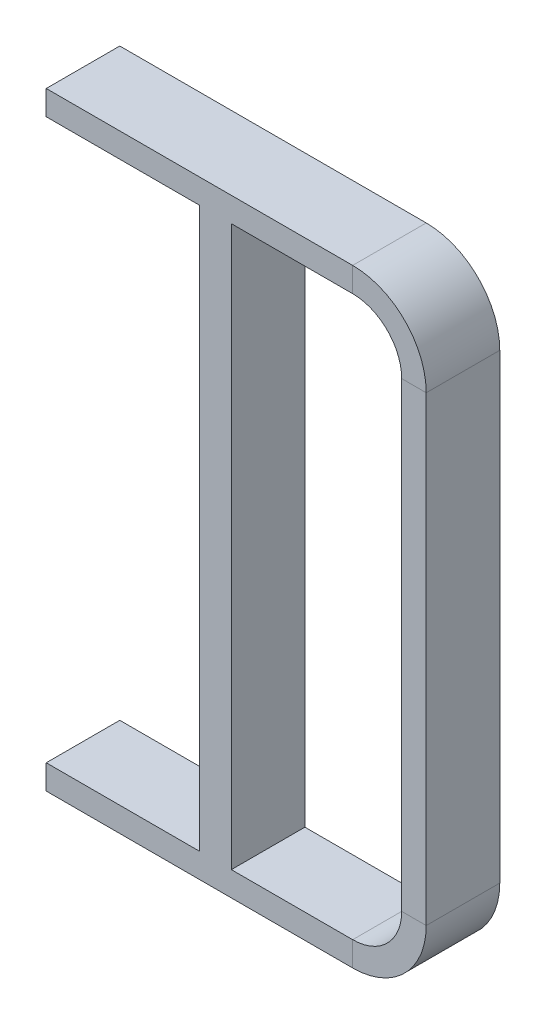
ISO-10303-21;
HEADER;
FILE_DESCRIPTION(('STEP AP214'),'2;1');
FILE_NAME('part.step','',(''),(''),'','','');
FILE_SCHEMA(('AUTOMOTIVE_DESIGN { 1 0 10303 214 1 1 1 1 }'));
ENDSEC;
DATA;
#1=APPLICATION_CONTEXT('core data for automotive mechanical design processes');
#2=APPLICATION_PROTOCOL_DEFINITION('international standard','automotive_design',2000,#1);
#3=PRODUCT_CONTEXT('',#1,'mechanical');
#4=PRODUCT('Part','Part','',(#3));
#5=PRODUCT_RELATED_PRODUCT_CATEGORY('part','',(#4));
#6=PRODUCT_DEFINITION_FORMATION('','',#4);
#7=PRODUCT_DEFINITION_CONTEXT('part definition',#1,'design');
#8=PRODUCT_DEFINITION('design','',#6,#7);
#9=PRODUCT_DEFINITION_SHAPE('','',#8);
#10=(LENGTH_UNIT() NAMED_UNIT(*) SI_UNIT(.MILLI.,.METRE.));
#11=(NAMED_UNIT(*) PLANE_ANGLE_UNIT() SI_UNIT($,.RADIAN.));
#12=(NAMED_UNIT(*) SI_UNIT($,.STERADIAN.) SOLID_ANGLE_UNIT());
#13=UNCERTAINTY_MEASURE_WITH_UNIT(LENGTH_MEASURE(1.E-05),#10,'distance_accuracy_value','');
#14=(GEOMETRIC_REPRESENTATION_CONTEXT(3) GLOBAL_UNCERTAINTY_ASSIGNED_CONTEXT((#13)) GLOBAL_UNIT_ASSIGNED_CONTEXT((#10,
#11,#12)) REPRESENTATION_CONTEXT('',''));
#15=CARTESIAN_POINT('',(0.,0.,0.));
#16=DIRECTION('',(0.,0.,1.));
#17=DIRECTION('',(1.,0.,0.));
#18=AXIS2_PLACEMENT_3D('',#15,#16,#17);
#19=CARTESIAN_POINT('',(0.,-25.4,76.2));
#20=DIRECTION('',(0.,-1.,0.));
#21=DIRECTION('',(0.,0.,-1.));
#22=AXIS2_PLACEMENT_3D('',#19,#20,#21);
#23=PLANE('',#22);
#24=DIRECTION('',(0.,0.,1.));
#25=VECTOR('',#24,1.);
#26=CARTESIAN_POINT('',(383.598972621392,-25.4,76.2000000000001));
#27=LINE('',#26,#25);
#28=CARTESIAN_POINT('',(383.598972621392,-25.4,-76.2));
#29=VERTEX_POINT('',#28);
#30=CARTESIAN_POINT('',(383.598972621392,-25.4,76.2));
#31=VERTEX_POINT('',#30);
#32=EDGE_CURVE('E183',#29,#31,#27,.T.);
#33=ORIENTED_EDGE('',*,*,#32,.F.);
#34=DIRECTION('',(1.,0.,0.));
#35=VECTOR('',#34,1.);
#36=CARTESIAN_POINT('',(0.,-25.4,-76.2));
#37=LINE('',#36,#35);
#38=CARTESIAN_POINT('',(635.,-25.4,-76.2));
#39=VERTEX_POINT('',#38);
#40=EDGE_CURVE('E157',#29,#39,#37,.T.);
#41=ORIENTED_EDGE('',*,*,#40,.T.);
#42=DIRECTION('',(0.,0.,-1.));
#43=VECTOR('',#42,1.);
#44=CARTESIAN_POINT('',(635.,-25.4,76.2));
#45=LINE('',#44,#43);
#46=CARTESIAN_POINT('',(635.,-25.4,76.2));
#47=VERTEX_POINT('',#46);
#48=EDGE_CURVE('E194',#47,#39,#45,.T.);
#49=ORIENTED_EDGE('',*,*,#48,.F.);
#50=DIRECTION('',(1.,0.,0.));
#51=VECTOR('',#50,1.);
#52=CARTESIAN_POINT('',(0.,-25.4,76.2));
#53=LINE('',#52,#51);
#54=EDGE_CURVE('E53',#31,#47,#53,.T.);
#55=ORIENTED_EDGE('',*,*,#54,.F.);
#56=EDGE_LOOP('',(#33,#41,#49,#55));
#57=FACE_BOUND('',#56,.T.);
#58=ADVANCED_FACE('F38',(#57),#23,.T.);
#59=CARTESIAN_POINT('',(635.,-1184.656,76.2));
#60=DIRECTION('',(0.,1.,0.));
#61=DIRECTION('',(-1.,0.,0.));
#62=AXIS2_PLACEMENT_3D('',#59,#60,#61);
#63=PLANE('',#62);
#64=DIRECTION('',(0.,0.,-1.));
#65=VECTOR('',#64,1.);
#66=CARTESIAN_POINT('',(383.598972621392,-1184.656,76.1999999999999));
#67=LINE('',#66,#65);
#68=CARTESIAN_POINT('',(383.598972621392,-1184.656,76.2));
#69=VERTEX_POINT('',#68);
#70=CARTESIAN_POINT('',(383.598972621392,-1184.656,-76.2));
#71=VERTEX_POINT('',#70);
#72=EDGE_CURVE('E167',#69,#71,#67,.T.);
#73=ORIENTED_EDGE('',*,*,#72,.F.);
#74=DIRECTION('',(-1.,0.,0.));
#75=VECTOR('',#74,1.);
#76=CARTESIAN_POINT('',(635.,-1184.656,76.2));
#77=LINE('',#76,#75);
#78=CARTESIAN_POINT('',(635.,-1184.656,76.2));
#79=VERTEX_POINT('',#78);
#80=EDGE_CURVE('E235',#79,#69,#77,.T.);
#81=ORIENTED_EDGE('',*,*,#80,.F.);
#82=DIRECTION('',(0.,0.,-1.));
#83=VECTOR('',#82,1.);
#84=CARTESIAN_POINT('',(635.,-1184.656,76.2));
#85=LINE('',#84,#83);
#86=CARTESIAN_POINT('',(635.,-1184.656,-76.2));
#87=VERTEX_POINT('',#86);
#88=EDGE_CURVE('E226',#79,#87,#85,.T.);
#89=ORIENTED_EDGE('',*,*,#88,.T.);
#90=DIRECTION('',(-1.,0.,0.));
#91=VECTOR('',#90,1.);
#92=CARTESIAN_POINT('',(635.,-1184.656,-76.2));
#93=LINE('',#92,#91);
#94=EDGE_CURVE('E266',#87,#71,#93,.T.);
#95=ORIENTED_EDGE('',*,*,#94,.T.);
#96=EDGE_LOOP('',(#73,#81,#89,#95));
#97=FACE_BOUND('',#96,.T.);
#98=ADVANCED_FACE('F354',(#97),#63,.T.);
#99=CARTESIAN_POINT('',(0.,0.,0.));
#100=DIRECTION('',(1.,0.,0.));
#101=DIRECTION('',(0.,0.,-1.));
#102=AXIS2_PLACEMENT_3D('',#99,#100,#101);
#103=PLANE('',#102);
#104=DIRECTION('',(0.,1.,0.));
#105=VECTOR('',#104,1.);
#106=CARTESIAN_POINT('',(0.,25.4,-76.2));
#107=LINE('',#106,#105);
#108=CARTESIAN_POINT('',(0.,-25.4,-76.2));
#109=VERTEX_POINT('',#108);
#110=CARTESIAN_POINT('',(0.,25.4,-76.2));
#111=VERTEX_POINT('',#110);
#112=EDGE_CURVE('E243',#109,#111,#107,.T.);
#113=ORIENTED_EDGE('',*,*,#112,.F.);
#114=DIRECTION('',(0.,0.,-1.));
#115=VECTOR('',#114,1.);
#116=CARTESIAN_POINT('',(0.,-25.4,76.2));
#117=LINE('',#116,#115);
#118=CARTESIAN_POINT('',(0.,-25.4,76.2));
#119=VERTEX_POINT('',#118);
#120=EDGE_CURVE('E152',#119,#109,#117,.T.);
#121=ORIENTED_EDGE('',*,*,#120,.F.);
#122=DIRECTION('',(0.,-1.,0.));
#123=VECTOR('',#122,1.);
#124=CARTESIAN_POINT('',(0.,25.4,76.2));
#125=LINE('',#124,#123);
#126=CARTESIAN_POINT('',(0.,25.4,76.2));
#127=VERTEX_POINT('',#126);
#128=EDGE_CURVE('E185',#127,#119,#125,.T.);
#129=ORIENTED_EDGE('',*,*,#128,.F.);
#130=DIRECTION('',(0.,0.,1.));
#131=VECTOR('',#130,1.);
#132=CARTESIAN_POINT('',(0.,25.4,76.2));
#133=LINE('',#132,#131);
#134=EDGE_CURVE('E196',#111,#127,#133,.T.);
#135=ORIENTED_EDGE('',*,*,#134,.F.);
#136=EDGE_LOOP('',(#113,#121,#129,#135));
#137=FACE_BOUND('',#136,.T.);
#138=ADVANCED_FACE('F40',(#137),#103,.F.);
#139=CARTESIAN_POINT('',(3.33066907387547E-13,-1210.056,0.));
#140=DIRECTION('',(-1.,0.,0.));
#141=DIRECTION('',(0.,0.,-1.));
#142=AXIS2_PLACEMENT_3D('',#139,#140,#141);
#143=PLANE('',#142);
#144=DIRECTION('',(0.,-1.,0.));
#145=VECTOR('',#144,1.);
#146=CARTESIAN_POINT('',(3.41948691584548E-13,-1235.456,-76.2));
#147=LINE('',#146,#145);
#148=CARTESIAN_POINT('',(4.39648317751562E-13,-1184.656,-76.2));
#149=VERTEX_POINT('',#148);
#150=CARTESIAN_POINT('',(4.48530101948563E-13,-1235.456,-76.2));
#151=VERTEX_POINT('',#150);
#152=EDGE_CURVE('E268',#149,#151,#147,.T.);
#153=ORIENTED_EDGE('',*,*,#152,.T.);
#154=DIRECTION('',(0.,0.,1.));
#155=VECTOR('',#154,1.);
#156=CARTESIAN_POINT('',(3.41948691584548E-13,-1235.456,76.2));
#157=LINE('',#156,#155);
#158=CARTESIAN_POINT('',(4.48530101948563E-13,-1235.456,76.2));
#159=VERTEX_POINT('',#158);
#160=EDGE_CURVE('E11',#151,#159,#157,.T.);
#161=ORIENTED_EDGE('',*,*,#160,.T.);
#162=DIRECTION('',(0.,1.,0.));
#163=VECTOR('',#162,1.);
#164=CARTESIAN_POINT('',(3.41948691584548E-13,-1235.456,76.2));
#165=LINE('',#164,#163);
#166=CARTESIAN_POINT('',(4.39648317751562E-13,-1184.656,76.2));
#167=VERTEX_POINT('',#166);
#168=EDGE_CURVE('E230',#159,#167,#165,.T.);
#169=ORIENTED_EDGE('',*,*,#168,.T.);
#170=DIRECTION('',(0.,0.,-1.));
#171=VECTOR('',#170,1.);
#172=CARTESIAN_POINT('',(3.24185123190546E-13,-1184.656,76.2));
#173=LINE('',#172,#171);
#174=EDGE_CURVE('E238',#167,#149,#173,.T.);
#175=ORIENTED_EDGE('',*,*,#174,.T.);
#176=EDGE_LOOP('',(#153,#161,#169,#175));
#177=FACE_BOUND('',#176,.T.);
#178=ADVANCED_FACE('F350',(#177),#143,.T.);
#179=CARTESIAN_POINT('',(0.,25.4,76.2));
#180=DIRECTION('',(0.,0.,1.));
#181=DIRECTION('',(1.,0.,0.));
#182=AXIS2_PLACEMENT_3D('',#179,#180,#181);
#183=PLANE('',#182);
#184=CARTESIAN_POINT('',(317.5,-25.4,76.2));
#185=VERTEX_POINT('',#184);
#186=EDGE_CURVE('E192',#119,#185,#53,.T.);
#187=ORIENTED_EDGE('',*,*,#186,.T.);
#188=DIRECTION('',(0.,1.,0.));
#189=VECTOR('',#188,1.);
#190=CARTESIAN_POINT('',(317.5,-1203.706,76.2));
#191=LINE('',#190,#189);
#192=CARTESIAN_POINT('',(317.5,-1184.656,76.2));
#193=VERTEX_POINT('',#192);
#194=EDGE_CURVE('E166',#193,#185,#191,.T.);
#195=ORIENTED_EDGE('',*,*,#194,.F.);
#196=EDGE_CURVE('E233',#193,#167,#77,.T.);
#197=ORIENTED_EDGE('',*,*,#196,.T.);
#198=ORIENTED_EDGE('',*,*,#168,.F.);
#199=DIRECTION('',(-1.,0.,0.));
#200=VECTOR('',#199,1.);
#201=CARTESIAN_POINT('',(635.,-1235.456,76.2));
#202=LINE('',#201,#200);
#203=CARTESIAN_POINT('',(635.,-1235.456,76.2));
#204=VERTEX_POINT('',#203);
#205=EDGE_CURVE('E234',#204,#159,#202,.T.);
#206=ORIENTED_EDGE('',*,*,#205,.F.);
#207=DIRECTION('',(0.,1.,0.));
#208=VECTOR('',#207,1.);
#209=CARTESIAN_POINT('',(635.,-1235.456,76.2));
#210=LINE('',#209,#208);
#211=EDGE_CURVE('E219',#204,#79,#210,.T.);
#212=ORIENTED_EDGE('',*,*,#211,.T.);
#213=ORIENTED_EDGE('',*,*,#80,.T.);
#214=DIRECTION('',(0.,1.,0.));
#215=VECTOR('',#214,1.);
#216=CARTESIAN_POINT('',(383.598972621392,-1203.706,76.2));
#217=LINE('',#216,#215);
#218=EDGE_CURVE('E175',#69,#31,#217,.T.);
#219=ORIENTED_EDGE('',*,*,#218,.T.);
#220=ORIENTED_EDGE('',*,*,#54,.T.);
#221=DIRECTION('',(0.,-1.,0.));
#222=VECTOR('',#221,1.);
#223=CARTESIAN_POINT('',(635.,25.4,76.2));
#224=LINE('',#223,#222);
#225=CARTESIAN_POINT('',(635.,25.4,76.2));
#226=VERTEX_POINT('',#225);
#227=EDGE_CURVE('E188',#226,#47,#224,.T.);
#228=ORIENTED_EDGE('',*,*,#227,.F.);
#229=DIRECTION('',(1.,0.,0.));
#230=VECTOR('',#229,1.);
#231=CARTESIAN_POINT('',(0.,25.4,76.2));
#232=LINE('',#231,#230);
#233=EDGE_CURVE('E191',#127,#226,#232,.T.);
#234=ORIENTED_EDGE('',*,*,#233,.F.);
#235=ORIENTED_EDGE('',*,*,#128,.T.);
#236=EDGE_LOOP('',(#187,#195,#197,#198,#206,#212,#213,#219,#220,#228,#234,#235));
#237=FACE_BOUND('',#236,.T.);
#238=ADVANCED_FACE('F330',(#237),#183,.T.);
#239=DIRECTION('',(0.,0.,-1.));
#240=VECTOR('',#239,1.);
#241=CARTESIAN_POINT('',(317.5,-25.4,76.2));
#242=LINE('',#241,#240);
#243=CARTESIAN_POINT('',(317.5,-25.4000000000001,-76.2));
#244=VERTEX_POINT('',#243);
#245=EDGE_CURVE('E61',#185,#244,#242,.T.);
#246=ORIENTED_EDGE('',*,*,#245,.F.);
#247=ORIENTED_EDGE('',*,*,#186,.F.);
#248=ORIENTED_EDGE('',*,*,#120,.T.);
#249=EDGE_CURVE('E150',#109,#244,#37,.T.);
#250=ORIENTED_EDGE('',*,*,#249,.T.);
#251=EDGE_LOOP('',(#246,#247,#248,#250));
#252=FACE_BOUND('',#251,.T.);
#253=ADVANCED_FACE('F151',(#252),#23,.T.);
#254=CARTESIAN_POINT('',(0.,25.4,-76.2));
#255=DIRECTION('',(0.,0.,-1.));
#256=DIRECTION('',(-1.,0.,0.));
#257=AXIS2_PLACEMENT_3D('',#254,#255,#256);
#258=PLANE('',#257);
#259=DIRECTION('',(1.,0.,0.));
#260=VECTOR('',#259,1.);
#261=CARTESIAN_POINT('',(0.,25.4,-76.2));
#262=LINE('',#261,#260);
#263=CARTESIAN_POINT('',(635.,25.4,-76.2));
#264=VERTEX_POINT('',#263);
#265=EDGE_CURVE('E272',#111,#264,#262,.T.);
#266=ORIENTED_EDGE('',*,*,#265,.T.);
#267=DIRECTION('',(0.,1.,0.));
#268=VECTOR('',#267,1.);
#269=CARTESIAN_POINT('',(635.,25.4,-76.2));
#270=LINE('',#269,#268);
#271=EDGE_CURVE('E156',#39,#264,#270,.T.);
#272=ORIENTED_EDGE('',*,*,#271,.F.);
#273=ORIENTED_EDGE('',*,*,#40,.F.);
#274=DIRECTION('',(0.,1.,0.));
#275=VECTOR('',#274,1.);
#276=CARTESIAN_POINT('',(383.598972621392,-1203.706,-76.2));
#277=LINE('',#276,#275);
#278=EDGE_CURVE('E179',#71,#29,#277,.T.);
#279=ORIENTED_EDGE('',*,*,#278,.F.);
#280=ORIENTED_EDGE('',*,*,#94,.F.);
#281=DIRECTION('',(0.,-1.,0.));
#282=VECTOR('',#281,1.);
#283=CARTESIAN_POINT('',(635.,-1235.456,-76.2));
#284=LINE('',#283,#282);
#285=CARTESIAN_POINT('',(635.,-1235.456,-76.2));
#286=VERTEX_POINT('',#285);
#287=EDGE_CURVE('E263',#87,#286,#284,.T.);
#288=ORIENTED_EDGE('',*,*,#287,.T.);
#289=DIRECTION('',(-1.,0.,0.));
#290=VECTOR('',#289,1.);
#291=CARTESIAN_POINT('',(635.,-1235.456,-76.2));
#292=LINE('',#291,#290);
#293=EDGE_CURVE('E46',#286,#151,#292,.T.);
#294=ORIENTED_EDGE('',*,*,#293,.T.);
#295=ORIENTED_EDGE('',*,*,#152,.F.);
#296=CARTESIAN_POINT('',(317.5,-1184.656,-76.2));
#297=VERTEX_POINT('',#296);
#298=EDGE_CURVE('E173',#297,#149,#93,.T.);
#299=ORIENTED_EDGE('',*,*,#298,.F.);
#300=DIRECTION('',(0.,1.,0.));
#301=VECTOR('',#300,1.);
#302=CARTESIAN_POINT('',(317.5,-1203.706,-76.2));
#303=LINE('',#302,#301);
#304=EDGE_CURVE('E164',#297,#244,#303,.T.);
#305=ORIENTED_EDGE('',*,*,#304,.T.);
#306=ORIENTED_EDGE('',*,*,#249,.F.);
#307=ORIENTED_EDGE('',*,*,#112,.T.);
#308=EDGE_LOOP('',(#266,#272,#273,#279,#280,#288,#294,#295,#299,#305,#306,#307));
#309=FACE_BOUND('',#308,.T.);
#310=ADVANCED_FACE('F171',(#309),#258,.T.);
#311=CARTESIAN_POINT('',(0.,25.4,76.2));
#312=DIRECTION('',(0.,1.,0.));
#313=DIRECTION('',(0.,0.,1.));
#314=AXIS2_PLACEMENT_3D('',#311,#312,#313);
#315=PLANE('',#314);
#316=ORIENTED_EDGE('',*,*,#233,.T.);
#317=DIRECTION('',(0.,0.,1.));
#318=VECTOR('',#317,1.);
#319=CARTESIAN_POINT('',(635.,25.4,76.2));
#320=LINE('',#319,#318);
#321=EDGE_CURVE('E207',#264,#226,#320,.T.);
#322=ORIENTED_EDGE('',*,*,#321,.F.);
#323=ORIENTED_EDGE('',*,*,#265,.F.);
#324=ORIENTED_EDGE('',*,*,#134,.T.);
#325=EDGE_LOOP('',(#316,#322,#323,#324));
#326=FACE_BOUND('',#325,.T.);
#327=ADVANCED_FACE('F344',(#326),#315,.T.);
#328=CARTESIAN_POINT('',(635.,25.4,76.2));
#329=DIRECTION('',(0.,0.,1.));
#330=DIRECTION('',(1.,0.,0.));
#331=AXIS2_PLACEMENT_3D('',#328,#329,#330);
#332=PLANE('',#331);
#333=CARTESIAN_POINT('',(635.,-127.,76.2));
#334=DIRECTION('',(0.,0.,-1.));
#335=DIRECTION('',(0.,1.,0.));
#336=AXIS2_PLACEMENT_3D('',#333,#334,#335);
#337=CIRCLE('',#336,101.6);
#338=CARTESIAN_POINT('',(736.6,-127.,76.2));
#339=VERTEX_POINT('',#338);
#340=EDGE_CURVE('E200',#47,#339,#337,.T.);
#341=ORIENTED_EDGE('',*,*,#340,.T.);
#342=DIRECTION('',(-1.,0.,0.));
#343=VECTOR('',#342,1.);
#344=CARTESIAN_POINT('',(787.4,-127.,76.2));
#345=LINE('',#344,#343);
#346=CARTESIAN_POINT('',(787.4,-127.,76.2));
#347=VERTEX_POINT('',#346);
#348=EDGE_CURVE('E197',#347,#339,#345,.T.);
#349=ORIENTED_EDGE('',*,*,#348,.F.);
#350=CARTESIAN_POINT('',(635.,-127.,76.2));
#351=DIRECTION('',(0.,0.,-1.));
#352=DIRECTION('',(0.,1.,0.));
#353=AXIS2_PLACEMENT_3D('',#350,#351,#352);
#354=CIRCLE('',#353,152.4);
#355=EDGE_CURVE('E201',#226,#347,#354,.T.);
#356=ORIENTED_EDGE('',*,*,#355,.F.);
#357=ORIENTED_EDGE('',*,*,#227,.T.);
#358=EDGE_LOOP('',(#341,#349,#356,#357));
#359=FACE_BOUND('',#358,.T.);
#360=ADVANCED_FACE('F322',(#359),#332,.T.);
#361=CARTESIAN_POINT('',(635.,-127.,0.));
#362=DIRECTION('',(0.,0.,-1.));
#363=DIRECTION('',(-1.,0.,0.));
#364=AXIS2_PLACEMENT_3D('',#361,#362,#363);
#365=CYLINDRICAL_SURFACE('',#364,101.6);
#366=CARTESIAN_POINT('',(635.,-127.,-76.2));
#367=DIRECTION('',(0.,0.,-1.));
#368=DIRECTION('',(0.,1.,0.));
#369=AXIS2_PLACEMENT_3D('',#366,#367,#368);
#370=CIRCLE('',#369,101.6);
#371=CARTESIAN_POINT('',(736.6,-127.,-76.2));
#372=VERTEX_POINT('',#371);
#373=EDGE_CURVE('E248',#39,#372,#370,.T.);
#374=ORIENTED_EDGE('',*,*,#373,.T.);
#375=DIRECTION('',(0.,0.,-1.));
#376=VECTOR('',#375,1.);
#377=CARTESIAN_POINT('',(736.6,-127.,76.2));
#378=LINE('',#377,#376);
#379=EDGE_CURVE('E204',#339,#372,#378,.T.);
#380=ORIENTED_EDGE('',*,*,#379,.F.);
#381=ORIENTED_EDGE('',*,*,#340,.F.);
#382=ORIENTED_EDGE('',*,*,#48,.T.);
#383=EDGE_LOOP('',(#374,#380,#381,#382));
#384=FACE_BOUND('',#383,.T.);
#385=ADVANCED_FACE('F335',(#384),#365,.F.);
#386=CARTESIAN_POINT('',(635.,25.4,-76.2));
#387=DIRECTION('',(0.,0.,-1.));
#388=DIRECTION('',(-1.,0.,0.));
#389=AXIS2_PLACEMENT_3D('',#386,#387,#388);
#390=PLANE('',#389);
#391=CARTESIAN_POINT('',(635.,-127.,-76.2));
#392=DIRECTION('',(0.,0.,-1.));
#393=DIRECTION('',(0.,1.,0.));
#394=AXIS2_PLACEMENT_3D('',#391,#392,#393);
#395=CIRCLE('',#394,152.4);
#396=CARTESIAN_POINT('',(787.4,-127.,-76.2));
#397=VERTEX_POINT('',#396);
#398=EDGE_CURVE('E276',#264,#397,#395,.T.);
#399=ORIENTED_EDGE('',*,*,#398,.T.);
#400=DIRECTION('',(1.,0.,0.));
#401=VECTOR('',#400,1.);
#402=CARTESIAN_POINT('',(787.4,-127.,-76.2));
#403=LINE('',#402,#401);
#404=EDGE_CURVE('E251',#372,#397,#403,.T.);
#405=ORIENTED_EDGE('',*,*,#404,.F.);
#406=ORIENTED_EDGE('',*,*,#373,.F.);
#407=ORIENTED_EDGE('',*,*,#271,.T.);
#408=EDGE_LOOP('',(#399,#405,#406,#407));
#409=FACE_BOUND('',#408,.T.);
#410=ADVANCED_FACE('F343',(#409),#390,.T.);
#411=CARTESIAN_POINT('',(635.,-127.,0.));
#412=DIRECTION('',(0.,0.,-1.));
#413=DIRECTION('',(-1.,0.,0.));
#414=AXIS2_PLACEMENT_3D('',#411,#412,#413);
#415=CYLINDRICAL_SURFACE('',#414,152.4);
#416=DIRECTION('',(0.,0.,1.));
#417=VECTOR('',#416,1.);
#418=CARTESIAN_POINT('',(787.4,-127.,76.2));
#419=LINE('',#418,#417);
#420=EDGE_CURVE('E218',#397,#347,#419,.T.);
#421=ORIENTED_EDGE('',*,*,#420,.F.);
#422=ORIENTED_EDGE('',*,*,#398,.F.);
#423=ORIENTED_EDGE('',*,*,#321,.T.);
#424=ORIENTED_EDGE('',*,*,#355,.T.);
#425=EDGE_LOOP('',(#421,#422,#423,#424));
#426=FACE_BOUND('',#425,.T.);
#427=ADVANCED_FACE('F324',(#426),#415,.T.);
#428=CARTESIAN_POINT('',(787.4,-127.,76.2));
#429=DIRECTION('',(0.,0.,1.));
#430=DIRECTION('',(1.,0.,0.));
#431=AXIS2_PLACEMENT_3D('',#428,#429,#430);
#432=PLANE('',#431);
#433=DIRECTION('',(0.,-1.,0.));
#434=VECTOR('',#433,1.);
#435=CARTESIAN_POINT('',(736.6,-127.,76.2));
#436=LINE('',#435,#434);
#437=CARTESIAN_POINT('',(736.6,-1083.056,76.2));
#438=VERTEX_POINT('',#437);
#439=EDGE_CURVE('E211',#339,#438,#436,.T.);
#440=ORIENTED_EDGE('',*,*,#439,.T.);
#441=DIRECTION('',(-1.,0.,0.));
#442=VECTOR('',#441,1.);
#443=CARTESIAN_POINT('',(787.4,-1083.056,76.2));
#444=LINE('',#443,#442);
#445=CARTESIAN_POINT('',(787.4,-1083.056,76.2));
#446=VERTEX_POINT('',#445);
#447=EDGE_CURVE('E208',#446,#438,#444,.T.);
#448=ORIENTED_EDGE('',*,*,#447,.F.);
#449=DIRECTION('',(0.,-1.,0.));
#450=VECTOR('',#449,1.);
#451=CARTESIAN_POINT('',(787.4,-127.,76.2));
#452=LINE('',#451,#450);
#453=EDGE_CURVE('E212',#347,#446,#452,.T.);
#454=ORIENTED_EDGE('',*,*,#453,.F.);
#455=ORIENTED_EDGE('',*,*,#348,.T.);
#456=EDGE_LOOP('',(#440,#448,#454,#455));
#457=FACE_BOUND('',#456,.T.);
#458=ADVANCED_FACE('F314',(#457),#432,.T.);
#459=CARTESIAN_POINT('',(736.6,-127.,76.2));
#460=DIRECTION('',(-1.,0.,0.));
#461=DIRECTION('',(0.,-1.,0.));
#462=AXIS2_PLACEMENT_3D('',#459,#460,#461);
#463=PLANE('',#462);
#464=DIRECTION('',(0.,-1.,0.));
#465=VECTOR('',#464,1.);
#466=CARTESIAN_POINT('',(736.6,-127.,-76.2));
#467=LINE('',#466,#465);
#468=CARTESIAN_POINT('',(736.6,-1083.056,-76.2));
#469=VERTEX_POINT('',#468);
#470=EDGE_CURVE('E254',#372,#469,#467,.T.);
#471=ORIENTED_EDGE('',*,*,#470,.T.);
#472=DIRECTION('',(0.,0.,-1.));
#473=VECTOR('',#472,1.);
#474=CARTESIAN_POINT('',(736.6,-1083.056,76.2));
#475=LINE('',#474,#473);
#476=EDGE_CURVE('E215',#438,#469,#475,.T.);
#477=ORIENTED_EDGE('',*,*,#476,.F.);
#478=ORIENTED_EDGE('',*,*,#439,.F.);
#479=ORIENTED_EDGE('',*,*,#379,.T.);
#480=EDGE_LOOP('',(#471,#477,#478,#479));
#481=FACE_BOUND('',#480,.T.);
#482=ADVANCED_FACE('F388',(#481),#463,.T.);
#483=CARTESIAN_POINT('',(787.4,-127.,-76.2));
#484=DIRECTION('',(0.,0.,-1.));
#485=DIRECTION('',(-1.,0.,0.));
#486=AXIS2_PLACEMENT_3D('',#483,#484,#485);
#487=PLANE('',#486);
#488=DIRECTION('',(0.,-1.,0.));
#489=VECTOR('',#488,1.);
#490=CARTESIAN_POINT('',(787.4,-127.,-76.2));
#491=LINE('',#490,#489);
#492=CARTESIAN_POINT('',(787.4,-1083.056,-76.2));
#493=VERTEX_POINT('',#492);
#494=EDGE_CURVE('E281',#397,#493,#491,.T.);
#495=ORIENTED_EDGE('',*,*,#494,.T.);
#496=DIRECTION('',(1.,0.,0.));
#497=VECTOR('',#496,1.);
#498=CARTESIAN_POINT('',(787.4,-1083.056,-76.2));
#499=LINE('',#498,#497);
#500=EDGE_CURVE('E257',#469,#493,#499,.T.);
#501=ORIENTED_EDGE('',*,*,#500,.F.);
#502=ORIENTED_EDGE('',*,*,#470,.F.);
#503=ORIENTED_EDGE('',*,*,#404,.T.);
#504=EDGE_LOOP('',(#495,#501,#502,#503));
#505=FACE_BOUND('',#504,.T.);
#506=ADVANCED_FACE('F396',(#505),#487,.T.);
#507=CARTESIAN_POINT('',(787.4,-127.,76.2));
#508=DIRECTION('',(1.,0.,0.));
#509=DIRECTION('',(0.,1.,0.));
#510=AXIS2_PLACEMENT_3D('',#507,#508,#509);
#511=PLANE('',#510);
#512=DIRECTION('',(0.,0.,1.));
#513=VECTOR('',#512,1.);
#514=CARTESIAN_POINT('',(787.4,-1083.056,76.2));
#515=LINE('',#514,#513);
#516=EDGE_CURVE('E229',#493,#446,#515,.T.);
#517=ORIENTED_EDGE('',*,*,#516,.F.);
#518=ORIENTED_EDGE('',*,*,#494,.F.);
#519=ORIENTED_EDGE('',*,*,#420,.T.);
#520=ORIENTED_EDGE('',*,*,#453,.T.);
#521=EDGE_LOOP('',(#517,#518,#519,#520));
#522=FACE_BOUND('',#521,.T.);
#523=ADVANCED_FACE('F315',(#522),#511,.T.);
#524=CARTESIAN_POINT('',(787.4,-1083.056,76.2));
#525=DIRECTION('',(0.,0.,1.));
#526=DIRECTION('',(1.,0.,0.));
#527=AXIS2_PLACEMENT_3D('',#524,#525,#526);
#528=PLANE('',#527);
#529=CARTESIAN_POINT('',(635.,-1083.056,76.2));
#530=DIRECTION('',(0.,0.,-1.));
#531=DIRECTION('',(1.,0.,0.));
#532=AXIS2_PLACEMENT_3D('',#529,#530,#531);
#533=CIRCLE('',#532,101.6);
#534=EDGE_CURVE('E222',#438,#79,#533,.T.);
#535=ORIENTED_EDGE('',*,*,#534,.T.);
#536=ORIENTED_EDGE('',*,*,#211,.F.);
#537=CARTESIAN_POINT('',(635.,-1083.056,76.2));
#538=DIRECTION('',(0.,0.,-1.));
#539=DIRECTION('',(1.,0.,0.));
#540=AXIS2_PLACEMENT_3D('',#537,#538,#539);
#541=CIRCLE('',#540,152.4);
#542=EDGE_CURVE('E223',#446,#204,#541,.T.);
#543=ORIENTED_EDGE('',*,*,#542,.F.);
#544=ORIENTED_EDGE('',*,*,#447,.T.);
#545=EDGE_LOOP('',(#535,#536,#543,#544));
#546=FACE_BOUND('',#545,.T.);
#547=ADVANCED_FACE('F307',(#546),#528,.T.);
#548=CARTESIAN_POINT('',(635.,-1083.056,0.));
#549=DIRECTION('',(0.,0.,-1.));
#550=DIRECTION('',(-1.,0.,0.));
#551=AXIS2_PLACEMENT_3D('',#548,#549,#550);
#552=CYLINDRICAL_SURFACE('',#551,101.6);
#553=CARTESIAN_POINT('',(635.,-1083.056,-76.2));
#554=DIRECTION('',(0.,0.,-1.));
#555=DIRECTION('',(1.,0.,0.));
#556=AXIS2_PLACEMENT_3D('',#553,#554,#555);
#557=CIRCLE('',#556,101.6);
#558=EDGE_CURVE('E260',#469,#87,#557,.T.);
#559=ORIENTED_EDGE('',*,*,#558,.T.);
#560=ORIENTED_EDGE('',*,*,#88,.F.);
#561=ORIENTED_EDGE('',*,*,#534,.F.);
#562=ORIENTED_EDGE('',*,*,#476,.T.);
#563=EDGE_LOOP('',(#559,#560,#561,#562));
#564=FACE_BOUND('',#563,.T.);
#565=ADVANCED_FACE('F390',(#564),#552,.F.);
#566=CARTESIAN_POINT('',(787.4,-1083.056,-76.2));
#567=DIRECTION('',(0.,0.,-1.));
#568=DIRECTION('',(-1.,0.,0.));
#569=AXIS2_PLACEMENT_3D('',#566,#567,#568);
#570=PLANE('',#569);
#571=CARTESIAN_POINT('',(635.,-1083.056,-76.2));
#572=DIRECTION('',(0.,0.,-1.));
#573=DIRECTION('',(1.,0.,0.));
#574=AXIS2_PLACEMENT_3D('',#571,#572,#573);
#575=CIRCLE('',#574,152.4);
#576=EDGE_CURVE('E286',#493,#286,#575,.T.);
#577=ORIENTED_EDGE('',*,*,#576,.T.);
#578=ORIENTED_EDGE('',*,*,#287,.F.);
#579=ORIENTED_EDGE('',*,*,#558,.F.);
#580=ORIENTED_EDGE('',*,*,#500,.T.);
#581=EDGE_LOOP('',(#577,#578,#579,#580));
#582=FACE_BOUND('',#581,.T.);
#583=ADVANCED_FACE('F361',(#582),#570,.T.);
#584=CARTESIAN_POINT('',(635.,-1083.056,0.));
#585=DIRECTION('',(0.,0.,-1.));
#586=DIRECTION('',(-1.,0.,0.));
#587=AXIS2_PLACEMENT_3D('',#584,#585,#586);
#588=CYLINDRICAL_SURFACE('',#587,152.4);
#589=DIRECTION('',(0.,0.,1.));
#590=VECTOR('',#589,1.);
#591=CARTESIAN_POINT('',(635.,-1235.456,76.2));
#592=LINE('',#591,#590);
#593=EDGE_CURVE('E241',#286,#204,#592,.T.);
#594=ORIENTED_EDGE('',*,*,#593,.F.);
#595=ORIENTED_EDGE('',*,*,#576,.F.);
#596=ORIENTED_EDGE('',*,*,#516,.T.);
#597=ORIENTED_EDGE('',*,*,#542,.T.);
#598=EDGE_LOOP('',(#594,#595,#596,#597));
#599=FACE_BOUND('',#598,.T.);
#600=ADVANCED_FACE('F309',(#599),#588,.T.);
#601=DIRECTION('',(0.,0.,1.));
#602=VECTOR('',#601,1.);
#603=CARTESIAN_POINT('',(317.5,-1184.656,76.2));
#604=LINE('',#603,#602);
#605=EDGE_CURVE('E168',#297,#193,#604,.T.);
#606=ORIENTED_EDGE('',*,*,#605,.F.);
#607=ORIENTED_EDGE('',*,*,#298,.T.);
#608=ORIENTED_EDGE('',*,*,#174,.F.);
#609=ORIENTED_EDGE('',*,*,#196,.F.);
#610=EDGE_LOOP('',(#606,#607,#608,#609));
#611=FACE_BOUND('',#610,.T.);
#612=ADVANCED_FACE('F351',(#611),#63,.T.);
#613=CARTESIAN_POINT('',(635.,-1235.456,76.2));
#614=DIRECTION('',(0.,-1.,0.));
#615=DIRECTION('',(1.,0.,0.));
#616=AXIS2_PLACEMENT_3D('',#613,#614,#615);
#617=PLANE('',#616);
#618=ORIENTED_EDGE('',*,*,#160,.F.);
#619=ORIENTED_EDGE('',*,*,#293,.F.);
#620=ORIENTED_EDGE('',*,*,#593,.T.);
#621=ORIENTED_EDGE('',*,*,#205,.T.);
#622=EDGE_LOOP('',(#618,#619,#620,#621));
#623=FACE_BOUND('',#622,.T.);
#624=ADVANCED_FACE('F304',(#623),#617,.T.);
#625=CARTESIAN_POINT('',(383.598972621392,-1203.706,-76.2));
#626=DIRECTION('',(1.,0.,0.));
#627=DIRECTION('',(0.,0.,-1.));
#628=AXIS2_PLACEMENT_3D('',#625,#626,#627);
#629=PLANE('',#628);
#630=ORIENTED_EDGE('',*,*,#278,.T.);
#631=ORIENTED_EDGE('',*,*,#32,.T.);
#632=ORIENTED_EDGE('',*,*,#218,.F.);
#633=ORIENTED_EDGE('',*,*,#72,.T.);
#634=EDGE_LOOP('',(#630,#631,#632,#633));
#635=FACE_BOUND('',#634,.T.);
#636=ADVANCED_FACE('F359',(#635),#629,.T.);
#637=CARTESIAN_POINT('',(317.5,-1203.706,-76.2));
#638=DIRECTION('',(-1.,0.,0.));
#639=DIRECTION('',(0.,0.,1.));
#640=AXIS2_PLACEMENT_3D('',#637,#638,#639);
#641=PLANE('',#640);
#642=ORIENTED_EDGE('',*,*,#194,.T.);
#643=ORIENTED_EDGE('',*,*,#245,.T.);
#644=ORIENTED_EDGE('',*,*,#304,.F.);
#645=ORIENTED_EDGE('',*,*,#605,.T.);
#646=EDGE_LOOP('',(#642,#643,#644,#645));
#647=FACE_BOUND('',#646,.T.);
#648=ADVANCED_FACE('F162',(#647),#641,.T.);
#649=CLOSED_SHELL('',(#58,#98,#138,#178,#238,#253,#310,#327,#360,#385,#410,#427,#458,#482,#506,
#523,#547,#565,#583,#600,#612,#624,#636,#648));
#650=MANIFOLD_SOLID_BREP('B2',#649);
#651=ADVANCED_BREP_SHAPE_REPRESENTATION('',(#18,#650),#14);
#652=SHAPE_DEFINITION_REPRESENTATION(#9,#651);
ENDSEC;
END-ISO-10303-21;
